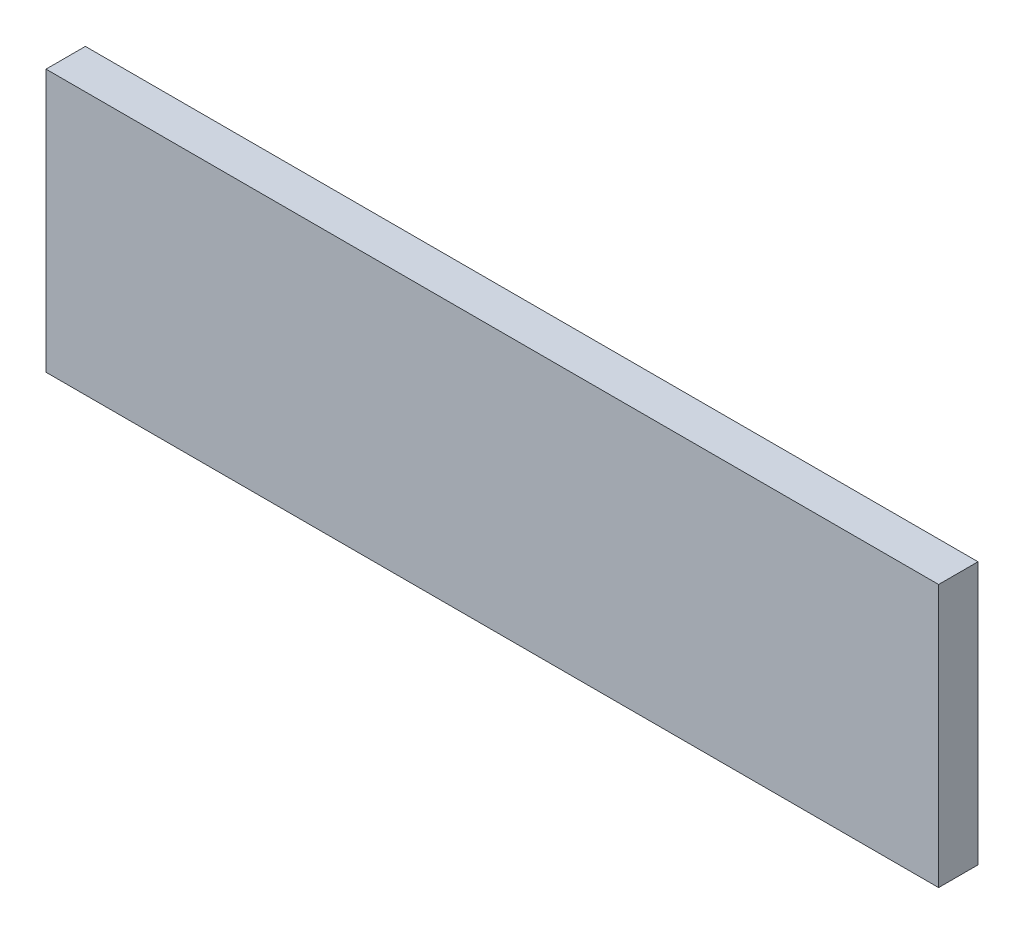
ISO-10303-21;
HEADER;
FILE_DESCRIPTION(('STEP AP214'),'2;1');
FILE_NAME('part.step','',(''),(''),'','','');
FILE_SCHEMA(('AUTOMOTIVE_DESIGN { 1 0 10303 214 1 1 1 1 }'));
ENDSEC;
DATA;
#1=APPLICATION_CONTEXT('core data for automotive mechanical design processes');
#2=APPLICATION_PROTOCOL_DEFINITION('international standard','automotive_design',2000,#1);
#3=PRODUCT_CONTEXT('',#1,'mechanical');
#4=PRODUCT('Part','Part','',(#3));
#5=PRODUCT_RELATED_PRODUCT_CATEGORY('part','',(#4));
#6=PRODUCT_DEFINITION_FORMATION('','',#4);
#7=PRODUCT_DEFINITION_CONTEXT('part definition',#1,'design');
#8=PRODUCT_DEFINITION('design','',#6,#7);
#9=PRODUCT_DEFINITION_SHAPE('','',#8);
#10=(LENGTH_UNIT() NAMED_UNIT(*) SI_UNIT(.MILLI.,.METRE.));
#11=(NAMED_UNIT(*) PLANE_ANGLE_UNIT() SI_UNIT($,.RADIAN.));
#12=(NAMED_UNIT(*) SI_UNIT($,.STERADIAN.) SOLID_ANGLE_UNIT());
#13=UNCERTAINTY_MEASURE_WITH_UNIT(LENGTH_MEASURE(1.E-05),#10,'distance_accuracy_value','');
#14=(GEOMETRIC_REPRESENTATION_CONTEXT(3) GLOBAL_UNCERTAINTY_ASSIGNED_CONTEXT((#13)) GLOBAL_UNIT_ASSIGNED_CONTEXT((#10,
#11,#12)) REPRESENTATION_CONTEXT('',''));
#15=CARTESIAN_POINT('',(0.,0.,0.));
#16=DIRECTION('',(0.,0.,1.));
#17=DIRECTION('',(1.,0.,0.));
#18=AXIS2_PLACEMENT_3D('',#15,#16,#17);
#19=CARTESIAN_POINT('',(0.,0.,19.05));
#20=DIRECTION('',(1.,0.,0.));
#21=DIRECTION('',(0.,0.,-1.));
#22=AXIS2_PLACEMENT_3D('',#19,#20,#21);
#23=PLANE('',#22);
#24=DIRECTION('',(0.,-1.,0.));
#25=VECTOR('',#24,1.);
#26=CARTESIAN_POINT('',(0.,0.,0.));
#27=LINE('',#26,#25);
#28=CARTESIAN_POINT('',(0.,127.,0.));
#29=VERTEX_POINT('',#28);
#30=CARTESIAN_POINT('',(0.,0.,0.));
#31=VERTEX_POINT('',#30);
#32=EDGE_CURVE('E98',#29,#31,#27,.T.);
#33=ORIENTED_EDGE('',*,*,#32,.T.);
#34=DIRECTION('',(0.,0.,-1.));
#35=VECTOR('',#34,1.);
#36=CARTESIAN_POINT('',(0.,0.,19.05));
#37=LINE('',#36,#35);
#38=CARTESIAN_POINT('',(0.,0.,19.05));
#39=VERTEX_POINT('',#38);
#40=EDGE_CURVE('E11',#39,#31,#37,.T.);
#41=ORIENTED_EDGE('',*,*,#40,.F.);
#42=DIRECTION('',(0.,-1.,0.));
#43=VECTOR('',#42,1.);
#44=CARTESIAN_POINT('',(0.,0.,19.05));
#45=LINE('',#44,#43);
#46=CARTESIAN_POINT('',(0.,127.,19.05));
#47=VERTEX_POINT('',#46);
#48=EDGE_CURVE('E86',#47,#39,#45,.T.);
#49=ORIENTED_EDGE('',*,*,#48,.F.);
#50=DIRECTION('',(0.,0.,-1.));
#51=VECTOR('',#50,1.);
#52=CARTESIAN_POINT('',(0.,127.,19.05));
#53=LINE('',#52,#51);
#54=EDGE_CURVE('E94',#47,#29,#53,.T.);
#55=ORIENTED_EDGE('',*,*,#54,.T.);
#56=EDGE_LOOP('',(#33,#41,#49,#55));
#57=FACE_BOUND('',#56,.T.);
#58=ADVANCED_FACE('F35',(#57),#23,.F.);
#59=CARTESIAN_POINT('',(0.,0.,19.05));
#60=DIRECTION('',(0.,1.,0.));
#61=DIRECTION('',(0.,0.,1.));
#62=AXIS2_PLACEMENT_3D('',#59,#60,#61);
#63=PLANE('',#62);
#64=DIRECTION('',(1.,0.,0.));
#65=VECTOR('',#64,1.);
#66=CARTESIAN_POINT('',(0.,0.,0.));
#67=LINE('',#66,#65);
#68=CARTESIAN_POINT('',(431.8,0.,0.));
#69=VERTEX_POINT('',#68);
#70=EDGE_CURVE('E90',#31,#69,#67,.T.);
#71=ORIENTED_EDGE('',*,*,#70,.T.);
#72=DIRECTION('',(0.,0.,-1.));
#73=VECTOR('',#72,1.);
#74=CARTESIAN_POINT('',(431.8,0.,19.05));
#75=LINE('',#74,#73);
#76=CARTESIAN_POINT('',(431.8,0.,19.05));
#77=VERTEX_POINT('',#76);
#78=EDGE_CURVE('E43',#77,#69,#75,.T.);
#79=ORIENTED_EDGE('',*,*,#78,.F.);
#80=DIRECTION('',(1.,0.,0.));
#81=VECTOR('',#80,1.);
#82=CARTESIAN_POINT('',(0.,0.,19.05));
#83=LINE('',#82,#81);
#84=EDGE_CURVE('E81',#39,#77,#83,.T.);
#85=ORIENTED_EDGE('',*,*,#84,.F.);
#86=ORIENTED_EDGE('',*,*,#40,.T.);
#87=EDGE_LOOP('',(#71,#79,#85,#86));
#88=FACE_BOUND('',#87,.T.);
#89=ADVANCED_FACE('F89',(#88),#63,.F.);
#90=CARTESIAN_POINT('',(431.8,0.,19.05));
#91=DIRECTION('',(-1.,0.,0.));
#92=DIRECTION('',(0.,0.,1.));
#93=AXIS2_PLACEMENT_3D('',#90,#91,#92);
#94=PLANE('',#93);
#95=DIRECTION('',(0.,1.,0.));
#96=VECTOR('',#95,1.);
#97=CARTESIAN_POINT('',(431.8,0.,0.));
#98=LINE('',#97,#96);
#99=CARTESIAN_POINT('',(431.8,127.,0.));
#100=VERTEX_POINT('',#99);
#101=EDGE_CURVE('E68',#69,#100,#98,.T.);
#102=ORIENTED_EDGE('',*,*,#101,.T.);
#103=DIRECTION('',(0.,0.,-1.));
#104=VECTOR('',#103,1.);
#105=CARTESIAN_POINT('',(431.8,127.,19.05));
#106=LINE('',#105,#104);
#107=CARTESIAN_POINT('',(431.8,127.,19.05));
#108=VERTEX_POINT('',#107);
#109=EDGE_CURVE('E91',#108,#100,#106,.T.);
#110=ORIENTED_EDGE('',*,*,#109,.F.);
#111=DIRECTION('',(0.,1.,0.));
#112=VECTOR('',#111,1.);
#113=CARTESIAN_POINT('',(431.8,0.,19.05));
#114=LINE('',#113,#112);
#115=EDGE_CURVE('E84',#77,#108,#114,.T.);
#116=ORIENTED_EDGE('',*,*,#115,.F.);
#117=ORIENTED_EDGE('',*,*,#78,.T.);
#118=EDGE_LOOP('',(#102,#110,#116,#117));
#119=FACE_BOUND('',#118,.T.);
#120=ADVANCED_FACE('F92',(#119),#94,.F.);
#121=CARTESIAN_POINT('',(0.,127.,19.05));
#122=DIRECTION('',(0.,-1.,0.));
#123=DIRECTION('',(0.,0.,-1.));
#124=AXIS2_PLACEMENT_3D('',#121,#122,#123);
#125=PLANE('',#124);
#126=DIRECTION('',(-1.,0.,0.));
#127=VECTOR('',#126,1.);
#128=CARTESIAN_POINT('',(0.,127.,0.));
#129=LINE('',#128,#127);
#130=EDGE_CURVE('E74',#100,#29,#129,.T.);
#131=ORIENTED_EDGE('',*,*,#130,.T.);
#132=ORIENTED_EDGE('',*,*,#54,.F.);
#133=DIRECTION('',(-1.,0.,0.));
#134=VECTOR('',#133,1.);
#135=CARTESIAN_POINT('',(0.,127.,19.05));
#136=LINE('',#135,#134);
#137=EDGE_CURVE('E51',#108,#47,#136,.T.);
#138=ORIENTED_EDGE('',*,*,#137,.F.);
#139=ORIENTED_EDGE('',*,*,#109,.T.);
#140=EDGE_LOOP('',(#131,#132,#138,#139));
#141=FACE_BOUND('',#140,.T.);
#142=ADVANCED_FACE('F105',(#141),#125,.F.);
#143=CARTESIAN_POINT('',(0.,0.,19.05));
#144=DIRECTION('',(0.,0.,-1.));
#145=DIRECTION('',(-1.,0.,0.));
#146=AXIS2_PLACEMENT_3D('',#143,#144,#145);
#147=PLANE('',#146);
#148=ORIENTED_EDGE('',*,*,#48,.T.);
#149=ORIENTED_EDGE('',*,*,#84,.T.);
#150=ORIENTED_EDGE('',*,*,#115,.T.);
#151=ORIENTED_EDGE('',*,*,#137,.T.);
#152=EDGE_LOOP('',(#148,#149,#150,#151));
#153=FACE_BOUND('',#152,.T.);
#154=ADVANCED_FACE('F82',(#153),#147,.F.);
#155=CARTESIAN_POINT('',(0.,0.,0.));
#156=DIRECTION('',(0.,0.,-1.));
#157=DIRECTION('',(-1.,0.,0.));
#158=AXIS2_PLACEMENT_3D('',#155,#156,#157);
#159=PLANE('',#158);
#160=ORIENTED_EDGE('',*,*,#32,.F.);
#161=ORIENTED_EDGE('',*,*,#130,.F.);
#162=ORIENTED_EDGE('',*,*,#101,.F.);
#163=ORIENTED_EDGE('',*,*,#70,.F.);
#164=EDGE_LOOP('',(#160,#161,#162,#163));
#165=FACE_BOUND('',#164,.T.);
#166=ADVANCED_FACE('F108',(#165),#159,.T.);
#167=CLOSED_SHELL('',(#58,#89,#120,#142,#154,#166));
#168=MANIFOLD_SOLID_BREP('B2',#167);
#169=ADVANCED_BREP_SHAPE_REPRESENTATION('',(#18,#168),#14);
#170=SHAPE_DEFINITION_REPRESENTATION(#9,#169);
ENDSEC;
END-ISO-10303-21;
